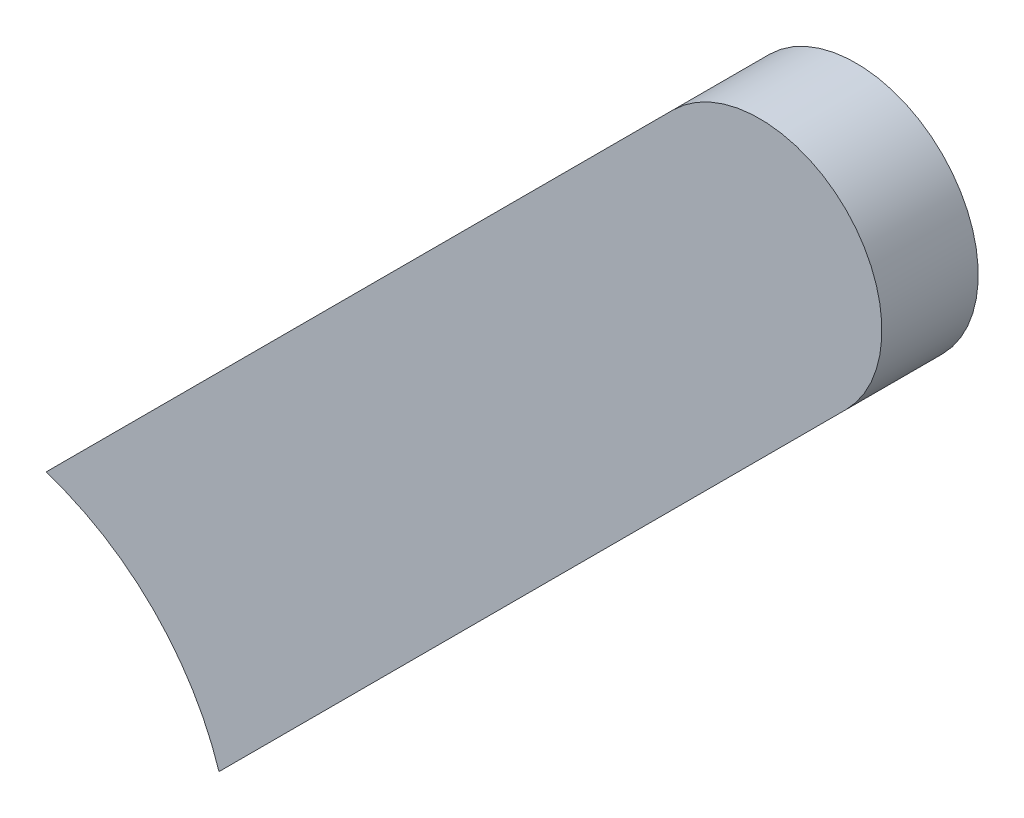
ISO-10303-21;
HEADER;
FILE_DESCRIPTION(('STEP AP214'),'2;1');
FILE_NAME('part.step','',(''),(''),'','','');
FILE_SCHEMA(('AUTOMOTIVE_DESIGN { 1 0 10303 214 1 1 1 1 }'));
ENDSEC;
DATA;
#1=APPLICATION_CONTEXT('core data for automotive mechanical design processes');
#2=APPLICATION_PROTOCOL_DEFINITION('international standard','automotive_design',2000,#1);
#3=PRODUCT_CONTEXT('',#1,'mechanical');
#4=PRODUCT('Part','Part','',(#3));
#5=PRODUCT_RELATED_PRODUCT_CATEGORY('part','',(#4));
#6=PRODUCT_DEFINITION_FORMATION('','',#4);
#7=PRODUCT_DEFINITION_CONTEXT('part definition',#1,'design');
#8=PRODUCT_DEFINITION('design','',#6,#7);
#9=PRODUCT_DEFINITION_SHAPE('','',#8);
#10=(LENGTH_UNIT() NAMED_UNIT(*) SI_UNIT(.MILLI.,.METRE.));
#11=(NAMED_UNIT(*) PLANE_ANGLE_UNIT() SI_UNIT($,.RADIAN.));
#12=(NAMED_UNIT(*) SI_UNIT($,.STERADIAN.) SOLID_ANGLE_UNIT());
#13=UNCERTAINTY_MEASURE_WITH_UNIT(LENGTH_MEASURE(1.E-05),#10,'distance_accuracy_value','');
#14=(GEOMETRIC_REPRESENTATION_CONTEXT(3) GLOBAL_UNCERTAINTY_ASSIGNED_CONTEXT((#13)) GLOBAL_UNIT_ASSIGNED_CONTEXT((#10,
#11,#12)) REPRESENTATION_CONTEXT('',''));
#15=CARTESIAN_POINT('',(0.,0.,0.));
#16=DIRECTION('',(0.,0.,1.));
#17=DIRECTION('',(1.,0.,0.));
#18=AXIS2_PLACEMENT_3D('',#15,#16,#17);
#19=CARTESIAN_POINT('',(149.499538404847,98.7183318648469,0.));
#20=DIRECTION('',(-0.707106781186545,0.707106781186551,0.));
#21=DIRECTION('',(0.707106781186551,0.707106781186545,0.));
#22=AXIS2_PLACEMENT_3D('',#19,#20,#21);
#23=PLANE('',#22);
#24=DIRECTION('',(0.707106781186551,0.707106781186545,0.));
#25=VECTOR('',#24,1.);
#26=CARTESIAN_POINT('',(149.15060594,98.3693994,0.1999996));
#27=LINE('',#26,#25);
#28=CARTESIAN_POINT('',(149.499538404847,98.7183318648469,0.1999996));
#29=VERTEX_POINT('',#28);
#30=CARTESIAN_POINT('',(150.8016034,100.02039686,0.1999996));
#31=VERTEX_POINT('',#30);
#32=EDGE_CURVE('E11',#29,#31,#27,.T.);
#33=ORIENTED_EDGE('',*,*,#32,.F.);
#34=DIRECTION('',(0.,0.,1.));
#35=VECTOR('',#34,1.);
#36=CARTESIAN_POINT('',(149.499538404847,98.7183318648469,0.));
#37=LINE('',#36,#35);
#38=CARTESIAN_POINT('',(149.499538404847,98.7183318648469,0.));
#39=VERTEX_POINT('',#38);
#40=EDGE_CURVE('E24',#39,#29,#37,.T.);
#41=ORIENTED_EDGE('',*,*,#40,.F.);
#42=DIRECTION('',(0.707106781186551,0.707106781186545,0.));
#43=VECTOR('',#42,1.);
#44=CARTESIAN_POINT('',(149.15060594,98.3693994,0.));
#45=LINE('',#44,#43);
#46=CARTESIAN_POINT('',(150.8016034,100.02039686,0.));
#47=VERTEX_POINT('',#46);
#48=EDGE_CURVE('E75',#39,#47,#45,.T.);
#49=ORIENTED_EDGE('',*,*,#48,.T.);
#50=DIRECTION('',(0.,0.,1.));
#51=VECTOR('',#50,1.);
#52=CARTESIAN_POINT('',(150.8016034,100.02039686,0.));
#53=LINE('',#52,#51);
#54=EDGE_CURVE('E37',#47,#31,#53,.T.);
#55=ORIENTED_EDGE('',*,*,#54,.T.);
#56=EDGE_LOOP('',(#33,#41,#49,#55));
#57=FACE_BOUND('',#56,.T.);
#58=ADVANCED_FACE('F17',(#57),#23,.F.);
#59=CARTESIAN_POINT('',(150.62199873,100.20000153,0.));
#60=DIRECTION('',(0.,0.,-1.));
#61=DIRECTION('',(0.707106781186548,-0.707106781186548,0.));
#62=AXIS2_PLACEMENT_3D('',#59,#60,#61);
#63=CYLINDRICAL_SURFACE('',#62,0.253999360179549);
#64=CARTESIAN_POINT('',(150.62199873,100.20000153,0.1999996));
#65=DIRECTION('',(0.,0.,1.));
#66=DIRECTION('',(0.707106781186548,-0.707106781186548,0.));
#67=AXIS2_PLACEMENT_3D('',#64,#65,#66);
#68=CIRCLE('',#67,0.253999360179549);
#69=CARTESIAN_POINT('',(150.44239406,100.3796062,0.1999996));
#70=VERTEX_POINT('',#69);
#71=EDGE_CURVE('E83',#31,#70,#68,.T.);
#72=ORIENTED_EDGE('',*,*,#71,.F.);
#73=ORIENTED_EDGE('',*,*,#54,.F.);
#74=CARTESIAN_POINT('',(150.62199873,100.20000153,0.));
#75=DIRECTION('',(0.,0.,1.));
#76=DIRECTION('',(0.707106781186548,-0.707106781186548,0.));
#77=AXIS2_PLACEMENT_3D('',#74,#75,#76);
#78=CIRCLE('',#77,0.253999360179549);
#79=CARTESIAN_POINT('',(150.44239406,100.3796062,0.));
#80=VERTEX_POINT('',#79);
#81=EDGE_CURVE('E81',#47,#80,#78,.T.);
#82=ORIENTED_EDGE('',*,*,#81,.T.);
#83=DIRECTION('',(0.,0.,1.));
#84=VECTOR('',#83,1.);
#85=CARTESIAN_POINT('',(150.44239406,100.3796062,0.));
#86=LINE('',#85,#84);
#87=EDGE_CURVE('E67',#80,#70,#86,.T.);
#88=ORIENTED_EDGE('',*,*,#87,.T.);
#89=EDGE_LOOP('',(#72,#73,#82,#88));
#90=FACE_BOUND('',#89,.T.);
#91=ADVANCED_FACE('F89',(#90),#63,.T.);
#92=CARTESIAN_POINT('',(150.44239406,100.3796062,0.));
#93=DIRECTION('',(0.707106781186551,-0.707106781186544,0.));
#94=DIRECTION('',(-0.707106781186544,-0.707106781186551,0.));
#95=AXIS2_PLACEMENT_3D('',#92,#93,#94);
#96=PLANE('',#95);
#97=DIRECTION('',(-0.707106781186544,-0.707106781186551,0.));
#98=VECTOR('',#97,1.);
#99=CARTESIAN_POINT('',(150.44239406,100.3796062,0.1999996));
#100=LINE('',#99,#98);
#101=CARTESIAN_POINT('',(149.140329064847,99.0775412048469,0.1999996));
#102=VERTEX_POINT('',#101);
#103=EDGE_CURVE('E71',#70,#102,#100,.T.);
#104=ORIENTED_EDGE('',*,*,#103,.F.);
#105=ORIENTED_EDGE('',*,*,#87,.F.);
#106=DIRECTION('',(-0.707106781186544,-0.707106781186551,0.));
#107=VECTOR('',#106,1.);
#108=CARTESIAN_POINT('',(150.44239406,100.3796062,0.));
#109=LINE('',#108,#107);
#110=CARTESIAN_POINT('',(149.140329064847,99.0775412048469,0.));
#111=VERTEX_POINT('',#110);
#112=EDGE_CURVE('E63',#80,#111,#109,.T.);
#113=ORIENTED_EDGE('',*,*,#112,.T.);
#114=DIRECTION('',(0.,0.,1.));
#115=VECTOR('',#114,1.);
#116=CARTESIAN_POINT('',(149.140329064847,99.0775412048469,0.));
#117=LINE('',#116,#115);
#118=EDGE_CURVE('E53',#111,#102,#117,.T.);
#119=ORIENTED_EDGE('',*,*,#118,.T.);
#120=EDGE_LOOP('',(#104,#105,#113,#119));
#121=FACE_BOUND('',#120,.T.);
#122=ADVANCED_FACE('F66',(#121),#96,.F.);
#123=CARTESIAN_POINT('',(148.971,98.5490028,0.));
#124=DIRECTION('',(0.,0.,-1.));
#125=DIRECTION('',(1.,0.,0.));
#126=AXIS2_PLACEMENT_3D('',#123,#124,#125);
#127=CYLINDRICAL_SURFACE('',#126,0.55500016);
#128=ORIENTED_EDGE('',*,*,#40,.T.);
#129=CARTESIAN_POINT('',(148.971,98.5490028,0.1999996));
#130=DIRECTION('',(0.,0.,1.));
#131=DIRECTION('',(1.,0.,0.));
#132=AXIS2_PLACEMENT_3D('',#129,#130,#131);
#133=CIRCLE('',#132,0.55500016);
#134=EDGE_CURVE('E59',#29,#102,#133,.T.);
#135=ORIENTED_EDGE('',*,*,#134,.T.);
#136=ORIENTED_EDGE('',*,*,#118,.F.);
#137=CARTESIAN_POINT('',(148.971,98.5490028,0.));
#138=DIRECTION('',(0.,0.,1.));
#139=DIRECTION('',(1.,0.,0.));
#140=AXIS2_PLACEMENT_3D('',#137,#138,#139);
#141=CIRCLE('',#140,0.55500016);
#142=EDGE_CURVE('E57',#39,#111,#141,.T.);
#143=ORIENTED_EDGE('',*,*,#142,.F.);
#144=EDGE_LOOP('',(#128,#135,#136,#143));
#145=FACE_BOUND('',#144,.T.);
#146=ADVANCED_FACE('F55',(#145),#127,.F.);
#147=CARTESIAN_POINT('',(149.15060594,98.3693994,0.));
#148=DIRECTION('',(0.,0.,-1.));
#149=DIRECTION('',(-1.,0.,0.));
#150=AXIS2_PLACEMENT_3D('',#147,#148,#149);
#151=PLANE('',#150);
#152=ORIENTED_EDGE('',*,*,#48,.F.);
#153=ORIENTED_EDGE('',*,*,#142,.T.);
#154=ORIENTED_EDGE('',*,*,#112,.F.);
#155=ORIENTED_EDGE('',*,*,#81,.F.);
#156=EDGE_LOOP('',(#152,#153,#154,#155));
#157=FACE_BOUND('',#156,.T.);
#158=ADVANCED_FACE('F74',(#157),#151,.T.);
#159=CARTESIAN_POINT('',(149.15060594,98.3693994,0.1999996));
#160=DIRECTION('',(0.,0.,-1.));
#161=DIRECTION('',(-1.,0.,0.));
#162=AXIS2_PLACEMENT_3D('',#159,#160,#161);
#163=PLANE('',#162);
#164=ORIENTED_EDGE('',*,*,#134,.F.);
#165=ORIENTED_EDGE('',*,*,#32,.T.);
#166=ORIENTED_EDGE('',*,*,#71,.T.);
#167=ORIENTED_EDGE('',*,*,#103,.T.);
#168=EDGE_LOOP('',(#164,#165,#166,#167));
#169=FACE_BOUND('',#168,.T.);
#170=ADVANCED_FACE('F91',(#169),#163,.F.);
#171=CLOSED_SHELL('',(#58,#91,#122,#146,#158,#170));
#172=MANIFOLD_SOLID_BREP('B1',#171);
#173=ADVANCED_BREP_SHAPE_REPRESENTATION('',(#18,#172),#14);
#174=SHAPE_DEFINITION_REPRESENTATION(#9,#173);
ENDSEC;
END-ISO-10303-21;
